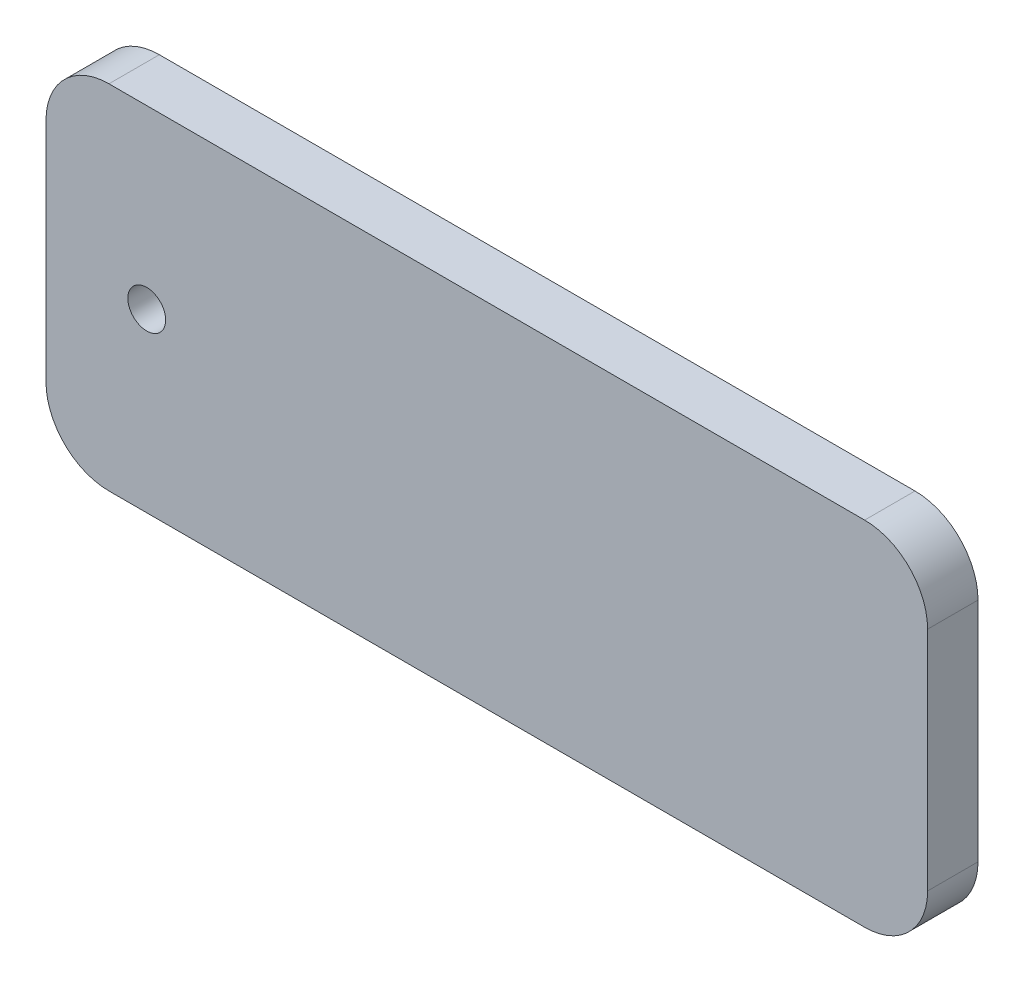
ISO-10303-21;
HEADER;
FILE_DESCRIPTION(('STEP AP214'),'2;1');
FILE_NAME('part.step','',(''),(''),'','','');
FILE_SCHEMA(('AUTOMOTIVE_DESIGN { 1 0 10303 214 1 1 1 1 }'));
ENDSEC;
DATA;
#1=APPLICATION_CONTEXT('core data for automotive mechanical design processes');
#2=APPLICATION_PROTOCOL_DEFINITION('international standard','automotive_design',2000,#1);
#3=PRODUCT_CONTEXT('',#1,'mechanical');
#4=PRODUCT('Part','Part','',(#3));
#5=PRODUCT_RELATED_PRODUCT_CATEGORY('part','',(#4));
#6=PRODUCT_DEFINITION_FORMATION('','',#4);
#7=PRODUCT_DEFINITION_CONTEXT('part definition',#1,'design');
#8=PRODUCT_DEFINITION('design','',#6,#7);
#9=PRODUCT_DEFINITION_SHAPE('','',#8);
#10=(LENGTH_UNIT() NAMED_UNIT(*) SI_UNIT(.MILLI.,.METRE.));
#11=(NAMED_UNIT(*) PLANE_ANGLE_UNIT() SI_UNIT($,.RADIAN.));
#12=(NAMED_UNIT(*) SI_UNIT($,.STERADIAN.) SOLID_ANGLE_UNIT());
#13=UNCERTAINTY_MEASURE_WITH_UNIT(LENGTH_MEASURE(1.E-05),#10,'distance_accuracy_value','');
#14=(GEOMETRIC_REPRESENTATION_CONTEXT(3) GLOBAL_UNCERTAINTY_ASSIGNED_CONTEXT((#13)) GLOBAL_UNIT_ASSIGNED_CONTEXT((#10,
#11,#12)) REPRESENTATION_CONTEXT('',''));
#15=CARTESIAN_POINT('',(0.,0.,0.));
#16=DIRECTION('',(0.,0.,1.));
#17=DIRECTION('',(1.,0.,0.));
#18=AXIS2_PLACEMENT_3D('',#15,#16,#17);
#19=CARTESIAN_POINT('',(5.,5.,4.));
#20=DIRECTION('',(0.,0.,-1.));
#21=DIRECTION('',(-1.,0.,0.));
#22=AXIS2_PLACEMENT_3D('',#19,#20,#21);
#23=PLANE('',#22);
#24=CARTESIAN_POINT('',(5.,5.,4.));
#25=DIRECTION('',(0.,0.,1.));
#26=DIRECTION('',(-1.,0.,0.));
#27=AXIS2_PLACEMENT_3D('',#24,#25,#26);
#28=CIRCLE('',#27,5.);
#29=CARTESIAN_POINT('',(0.,5.00000000000004,4.));
#30=VERTEX_POINT('',#29);
#31=CARTESIAN_POINT('',(5.00000000000004,0.,4.));
#32=VERTEX_POINT('',#31);
#33=EDGE_CURVE('E143',#30,#32,#28,.T.);
#34=ORIENTED_EDGE('',*,*,#33,.T.);
#35=DIRECTION('',(1.,0.,0.));
#36=VECTOR('',#35,1.);
#37=CARTESIAN_POINT('',(5.00000000000004,0.,4.));
#38=LINE('',#37,#36);
#39=CARTESIAN_POINT('',(65.,0.,4.));
#40=VERTEX_POINT('',#39);
#41=EDGE_CURVE('E91',#32,#40,#38,.T.);
#42=ORIENTED_EDGE('',*,*,#41,.T.);
#43=CARTESIAN_POINT('',(65.,5.,4.));
#44=DIRECTION('',(0.,0.,1.));
#45=DIRECTION('',(1.,0.,0.));
#46=AXIS2_PLACEMENT_3D('',#43,#44,#45);
#47=CIRCLE('',#46,5.);
#48=CARTESIAN_POINT('',(70.,5.00000000000004,4.));
#49=VERTEX_POINT('',#48);
#50=EDGE_CURVE('E158',#40,#49,#47,.T.);
#51=ORIENTED_EDGE('',*,*,#50,.T.);
#52=DIRECTION('',(0.,1.,0.));
#53=VECTOR('',#52,1.);
#54=CARTESIAN_POINT('',(70.,5.00000000000004,4.));
#55=LINE('',#54,#53);
#56=CARTESIAN_POINT('',(70.,23.,4.));
#57=VERTEX_POINT('',#56);
#58=EDGE_CURVE('E171',#49,#57,#55,.T.);
#59=ORIENTED_EDGE('',*,*,#58,.T.);
#60=CARTESIAN_POINT('',(65.,23.,4.));
#61=DIRECTION('',(0.,0.,1.));
#62=DIRECTION('',(-1.,0.,0.));
#63=AXIS2_PLACEMENT_3D('',#60,#61,#62);
#64=CIRCLE('',#63,5.);
#65=CARTESIAN_POINT('',(65.,28.,4.));
#66=VERTEX_POINT('',#65);
#67=EDGE_CURVE('E110',#57,#66,#64,.T.);
#68=ORIENTED_EDGE('',*,*,#67,.T.);
#69=DIRECTION('',(-1.,0.,0.));
#70=VECTOR('',#69,1.);
#71=CARTESIAN_POINT('',(5.00000000000004,28.,4.));
#72=LINE('',#71,#70);
#73=CARTESIAN_POINT('',(5.00000000000004,28.,4.));
#74=VERTEX_POINT('',#73);
#75=EDGE_CURVE('E104',#66,#74,#72,.T.);
#76=ORIENTED_EDGE('',*,*,#75,.T.);
#77=CARTESIAN_POINT('',(5.,23.,4.));
#78=DIRECTION('',(0.,0.,1.));
#79=DIRECTION('',(-1.,0.,0.));
#80=AXIS2_PLACEMENT_3D('',#77,#78,#79);
#81=CIRCLE('',#80,5.);
#82=CARTESIAN_POINT('',(0.,23.,4.));
#83=VERTEX_POINT('',#82);
#84=EDGE_CURVE('E108',#74,#83,#81,.T.);
#85=ORIENTED_EDGE('',*,*,#84,.T.);
#86=DIRECTION('',(0.,-1.,0.));
#87=VECTOR('',#86,1.);
#88=CARTESIAN_POINT('',(0.,5.00000000000004,4.));
#89=LINE('',#88,#87);
#90=EDGE_CURVE('E48',#83,#30,#89,.T.);
#91=ORIENTED_EDGE('',*,*,#90,.T.);
#92=EDGE_LOOP('',(#34,#42,#51,#59,#68,#76,#85,#91));
#93=FACE_BOUND('',#92,.T.);
#94=CARTESIAN_POINT('',(8.,14.,4.));
#95=DIRECTION('',(0.,0.,1.));
#96=DIRECTION('',(1.,0.,0.));
#97=AXIS2_PLACEMENT_3D('',#94,#95,#96);
#98=CIRCLE('',#97,1.5);
#99=CARTESIAN_POINT('',(9.5,14.,4.));
#100=VERTEX_POINT('',#99);
#101=EDGE_CURVE('E132',#100,#100,#98,.T.);
#102=ORIENTED_EDGE('',*,*,#101,.F.);
#103=EDGE_LOOP('',(#102));
#104=FACE_BOUND('',#103,.T.);
#105=ADVANCED_FACE('F31',(#93,#104),#23,.F.);
#106=CARTESIAN_POINT('',(5.,5.,0.));
#107=DIRECTION('',(0.,0.,-1.));
#108=DIRECTION('',(-1.,0.,0.));
#109=AXIS2_PLACEMENT_3D('',#106,#107,#108);
#110=PLANE('',#109);
#111=CARTESIAN_POINT('',(5.,5.,0.));
#112=DIRECTION('',(0.,0.,1.));
#113=DIRECTION('',(-1.,0.,0.));
#114=AXIS2_PLACEMENT_3D('',#111,#112,#113);
#115=CIRCLE('',#114,5.);
#116=CARTESIAN_POINT('',(0.,5.00000000000004,0.));
#117=VERTEX_POINT('',#116);
#118=CARTESIAN_POINT('',(5.00000000000004,0.,0.));
#119=VERTEX_POINT('',#118);
#120=EDGE_CURVE('E128',#117,#119,#115,.T.);
#121=ORIENTED_EDGE('',*,*,#120,.F.);
#122=DIRECTION('',(0.,-1.,0.));
#123=VECTOR('',#122,1.);
#124=CARTESIAN_POINT('',(0.,5.00000000000004,0.));
#125=LINE('',#124,#123);
#126=CARTESIAN_POINT('',(0.,23.,0.));
#127=VERTEX_POINT('',#126);
#128=EDGE_CURVE('E83',#127,#117,#125,.T.);
#129=ORIENTED_EDGE('',*,*,#128,.F.);
#130=CARTESIAN_POINT('',(5.,23.,0.));
#131=DIRECTION('',(0.,0.,1.));
#132=DIRECTION('',(-1.,0.,0.));
#133=AXIS2_PLACEMENT_3D('',#130,#131,#132);
#134=CIRCLE('',#133,5.);
#135=CARTESIAN_POINT('',(5.00000000000004,28.,0.));
#136=VERTEX_POINT('',#135);
#137=EDGE_CURVE('E77',#136,#127,#134,.T.);
#138=ORIENTED_EDGE('',*,*,#137,.F.);
#139=DIRECTION('',(-1.,0.,0.));
#140=VECTOR('',#139,1.);
#141=CARTESIAN_POINT('',(5.00000000000004,28.,0.));
#142=LINE('',#141,#140);
#143=CARTESIAN_POINT('',(65.,28.,0.));
#144=VERTEX_POINT('',#143);
#145=EDGE_CURVE('E118',#144,#136,#142,.T.);
#146=ORIENTED_EDGE('',*,*,#145,.F.);
#147=CARTESIAN_POINT('',(65.,23.,0.));
#148=DIRECTION('',(0.,0.,1.));
#149=DIRECTION('',(-1.,0.,0.));
#150=AXIS2_PLACEMENT_3D('',#147,#148,#149);
#151=CIRCLE('',#150,5.);
#152=CARTESIAN_POINT('',(70.,23.,0.));
#153=VERTEX_POINT('',#152);
#154=EDGE_CURVE('E138',#153,#144,#151,.T.);
#155=ORIENTED_EDGE('',*,*,#154,.F.);
#156=DIRECTION('',(0.,1.,0.));
#157=VECTOR('',#156,1.);
#158=CARTESIAN_POINT('',(70.,5.00000000000004,0.));
#159=LINE('',#158,#157);
#160=CARTESIAN_POINT('',(70.,5.00000000000004,0.));
#161=VERTEX_POINT('',#160);
#162=EDGE_CURVE('E136',#161,#153,#159,.T.);
#163=ORIENTED_EDGE('',*,*,#162,.F.);
#164=CARTESIAN_POINT('',(65.,5.,0.));
#165=DIRECTION('',(0.,0.,1.));
#166=DIRECTION('',(1.,0.,0.));
#167=AXIS2_PLACEMENT_3D('',#164,#165,#166);
#168=CIRCLE('',#167,5.);
#169=CARTESIAN_POINT('',(65.,0.,0.));
#170=VERTEX_POINT('',#169);
#171=EDGE_CURVE('E134',#170,#161,#168,.T.);
#172=ORIENTED_EDGE('',*,*,#171,.F.);
#173=DIRECTION('',(1.,0.,0.));
#174=VECTOR('',#173,1.);
#175=CARTESIAN_POINT('',(5.00000000000004,0.,0.));
#176=LINE('',#175,#174);
#177=EDGE_CURVE('E131',#119,#170,#176,.T.);
#178=ORIENTED_EDGE('',*,*,#177,.F.);
#179=EDGE_LOOP('',(#121,#129,#138,#146,#155,#163,#172,#178));
#180=FACE_BOUND('',#179,.T.);
#181=CARTESIAN_POINT('',(8.,14.,0.));
#182=DIRECTION('',(0.,0.,1.));
#183=DIRECTION('',(1.,0.,0.));
#184=AXIS2_PLACEMENT_3D('',#181,#182,#183);
#185=CIRCLE('',#184,1.5);
#186=CARTESIAN_POINT('',(9.5,14.,0.));
#187=VERTEX_POINT('',#186);
#188=EDGE_CURVE('E177',#187,#187,#185,.T.);
#189=ORIENTED_EDGE('',*,*,#188,.T.);
#190=EDGE_LOOP('',(#189));
#191=FACE_BOUND('',#190,.T.);
#192=ADVANCED_FACE('F162',(#180,#191),#110,.T.);
#193=CARTESIAN_POINT('',(5.,5.,4.));
#194=DIRECTION('',(0.,0.,-1.));
#195=DIRECTION('',(-1.,0.,0.));
#196=AXIS2_PLACEMENT_3D('',#193,#194,#195);
#197=CYLINDRICAL_SURFACE('',#196,5.);
#198=ORIENTED_EDGE('',*,*,#120,.T.);
#199=DIRECTION('',(0.,0.,-1.));
#200=VECTOR('',#199,1.);
#201=CARTESIAN_POINT('',(5.00000000000004,0.,4.));
#202=LINE('',#201,#200);
#203=EDGE_CURVE('E11',#32,#119,#202,.T.);
#204=ORIENTED_EDGE('',*,*,#203,.F.);
#205=ORIENTED_EDGE('',*,*,#33,.F.);
#206=DIRECTION('',(0.,0.,-1.));
#207=VECTOR('',#206,1.);
#208=CARTESIAN_POINT('',(0.,5.00000000000004,4.));
#209=LINE('',#208,#207);
#210=EDGE_CURVE('E124',#30,#117,#209,.T.);
#211=ORIENTED_EDGE('',*,*,#210,.T.);
#212=EDGE_LOOP('',(#198,#204,#205,#211));
#213=FACE_BOUND('',#212,.T.);
#214=ADVANCED_FACE('F33',(#213),#197,.T.);
#215=CARTESIAN_POINT('',(5.00000000000004,0.,4.));
#216=DIRECTION('',(0.,1.,0.));
#217=DIRECTION('',(0.,0.,1.));
#218=AXIS2_PLACEMENT_3D('',#215,#216,#217);
#219=PLANE('',#218);
#220=ORIENTED_EDGE('',*,*,#177,.T.);
#221=DIRECTION('',(0.,0.,-1.));
#222=VECTOR('',#221,1.);
#223=CARTESIAN_POINT('',(65.,0.,4.));
#224=LINE('',#223,#222);
#225=EDGE_CURVE('E40',#40,#170,#224,.T.);
#226=ORIENTED_EDGE('',*,*,#225,.F.);
#227=ORIENTED_EDGE('',*,*,#41,.F.);
#228=ORIENTED_EDGE('',*,*,#203,.T.);
#229=EDGE_LOOP('',(#220,#226,#227,#228));
#230=FACE_BOUND('',#229,.T.);
#231=ADVANCED_FACE('F205',(#230),#219,.F.);
#232=CARTESIAN_POINT('',(65.,5.,4.));
#233=DIRECTION('',(0.,0.,-1.));
#234=DIRECTION('',(-1.,0.,0.));
#235=AXIS2_PLACEMENT_3D('',#232,#233,#234);
#236=CYLINDRICAL_SURFACE('',#235,5.);
#237=ORIENTED_EDGE('',*,*,#171,.T.);
#238=DIRECTION('',(0.,0.,-1.));
#239=VECTOR('',#238,1.);
#240=CARTESIAN_POINT('',(70.,5.00000000000004,4.));
#241=LINE('',#240,#239);
#242=EDGE_CURVE('E150',#49,#161,#241,.T.);
#243=ORIENTED_EDGE('',*,*,#242,.F.);
#244=ORIENTED_EDGE('',*,*,#50,.F.);
#245=ORIENTED_EDGE('',*,*,#225,.T.);
#246=EDGE_LOOP('',(#237,#243,#244,#245));
#247=FACE_BOUND('',#246,.T.);
#248=ADVANCED_FACE('F156',(#247),#236,.T.);
#249=CARTESIAN_POINT('',(70.,5.00000000000004,4.));
#250=DIRECTION('',(-1.,0.,0.));
#251=DIRECTION('',(0.,0.,1.));
#252=AXIS2_PLACEMENT_3D('',#249,#250,#251);
#253=PLANE('',#252);
#254=ORIENTED_EDGE('',*,*,#162,.T.);
#255=DIRECTION('',(0.,0.,-1.));
#256=VECTOR('',#255,1.);
#257=CARTESIAN_POINT('',(70.,23.,4.));
#258=LINE('',#257,#256);
#259=EDGE_CURVE('E147',#57,#153,#258,.T.);
#260=ORIENTED_EDGE('',*,*,#259,.F.);
#261=ORIENTED_EDGE('',*,*,#58,.F.);
#262=ORIENTED_EDGE('',*,*,#242,.T.);
#263=EDGE_LOOP('',(#254,#260,#261,#262));
#264=FACE_BOUND('',#263,.T.);
#265=ADVANCED_FACE('F167',(#264),#253,.F.);
#266=CARTESIAN_POINT('',(65.,23.,4.));
#267=DIRECTION('',(0.,0.,-1.));
#268=DIRECTION('',(-1.,0.,0.));
#269=AXIS2_PLACEMENT_3D('',#266,#267,#268);
#270=CYLINDRICAL_SURFACE('',#269,5.);
#271=ORIENTED_EDGE('',*,*,#154,.T.);
#272=DIRECTION('',(0.,0.,-1.));
#273=VECTOR('',#272,1.);
#274=CARTESIAN_POINT('',(65.,28.,4.));
#275=LINE('',#274,#273);
#276=EDGE_CURVE('E119',#66,#144,#275,.T.);
#277=ORIENTED_EDGE('',*,*,#276,.F.);
#278=ORIENTED_EDGE('',*,*,#67,.F.);
#279=ORIENTED_EDGE('',*,*,#259,.T.);
#280=EDGE_LOOP('',(#271,#277,#278,#279));
#281=FACE_BOUND('',#280,.T.);
#282=ADVANCED_FACE('F170',(#281),#270,.T.);
#283=CARTESIAN_POINT('',(5.00000000000004,28.,4.));
#284=DIRECTION('',(0.,-1.,0.));
#285=DIRECTION('',(0.,0.,-1.));
#286=AXIS2_PLACEMENT_3D('',#283,#284,#285);
#287=PLANE('',#286);
#288=ORIENTED_EDGE('',*,*,#145,.T.);
#289=DIRECTION('',(0.,0.,-1.));
#290=VECTOR('',#289,1.);
#291=CARTESIAN_POINT('',(5.00000000000004,28.,4.));
#292=LINE('',#291,#290);
#293=EDGE_CURVE('E115',#74,#136,#292,.T.);
#294=ORIENTED_EDGE('',*,*,#293,.F.);
#295=ORIENTED_EDGE('',*,*,#75,.F.);
#296=ORIENTED_EDGE('',*,*,#276,.T.);
#297=EDGE_LOOP('',(#288,#294,#295,#296));
#298=FACE_BOUND('',#297,.T.);
#299=ADVANCED_FACE('F116',(#298),#287,.F.);
#300=CARTESIAN_POINT('',(5.,23.,4.));
#301=DIRECTION('',(0.,0.,-1.));
#302=DIRECTION('',(-1.,0.,0.));
#303=AXIS2_PLACEMENT_3D('',#300,#301,#302);
#304=CYLINDRICAL_SURFACE('',#303,5.);
#305=ORIENTED_EDGE('',*,*,#137,.T.);
#306=DIRECTION('',(0.,0.,-1.));
#307=VECTOR('',#306,1.);
#308=CARTESIAN_POINT('',(0.,23.,4.));
#309=LINE('',#308,#307);
#310=EDGE_CURVE('E120',#83,#127,#309,.T.);
#311=ORIENTED_EDGE('',*,*,#310,.F.);
#312=ORIENTED_EDGE('',*,*,#84,.F.);
#313=ORIENTED_EDGE('',*,*,#293,.T.);
#314=EDGE_LOOP('',(#305,#311,#312,#313));
#315=FACE_BOUND('',#314,.T.);
#316=ADVANCED_FACE('F122',(#315),#304,.T.);
#317=CARTESIAN_POINT('',(0.,5.00000000000004,4.));
#318=DIRECTION('',(1.,0.,0.));
#319=DIRECTION('',(0.,0.,-1.));
#320=AXIS2_PLACEMENT_3D('',#317,#318,#319);
#321=PLANE('',#320);
#322=ORIENTED_EDGE('',*,*,#128,.T.);
#323=ORIENTED_EDGE('',*,*,#210,.F.);
#324=ORIENTED_EDGE('',*,*,#90,.F.);
#325=ORIENTED_EDGE('',*,*,#310,.T.);
#326=EDGE_LOOP('',(#322,#323,#324,#325));
#327=FACE_BOUND('',#326,.T.);
#328=ADVANCED_FACE('F193',(#327),#321,.F.);
#329=CARTESIAN_POINT('',(8.,14.,4.));
#330=DIRECTION('',(0.,0.,-1.));
#331=DIRECTION('',(-1.,0.,0.));
#332=AXIS2_PLACEMENT_3D('',#329,#330,#331);
#333=CYLINDRICAL_SURFACE('',#332,1.5);
#334=ORIENTED_EDGE('',*,*,#101,.T.);
#335=EDGE_LOOP('',(#334));
#336=FACE_BOUND('',#335,.T.);
#337=ORIENTED_EDGE('',*,*,#188,.F.);
#338=EDGE_LOOP('',(#337));
#339=FACE_BOUND('',#338,.T.);
#340=ADVANCED_FACE('F183',(#336,#339),#333,.F.);
#341=CLOSED_SHELL('',(#105,#192,#214,#231,#248,#265,#282,#299,#316,#328,#340));
#342=MANIFOLD_SOLID_BREP('B2',#341);
#343=ADVANCED_BREP_SHAPE_REPRESENTATION('',(#18,#342),#14);
#344=SHAPE_DEFINITION_REPRESENTATION(#9,#343);
ENDSEC;
END-ISO-10303-21;
